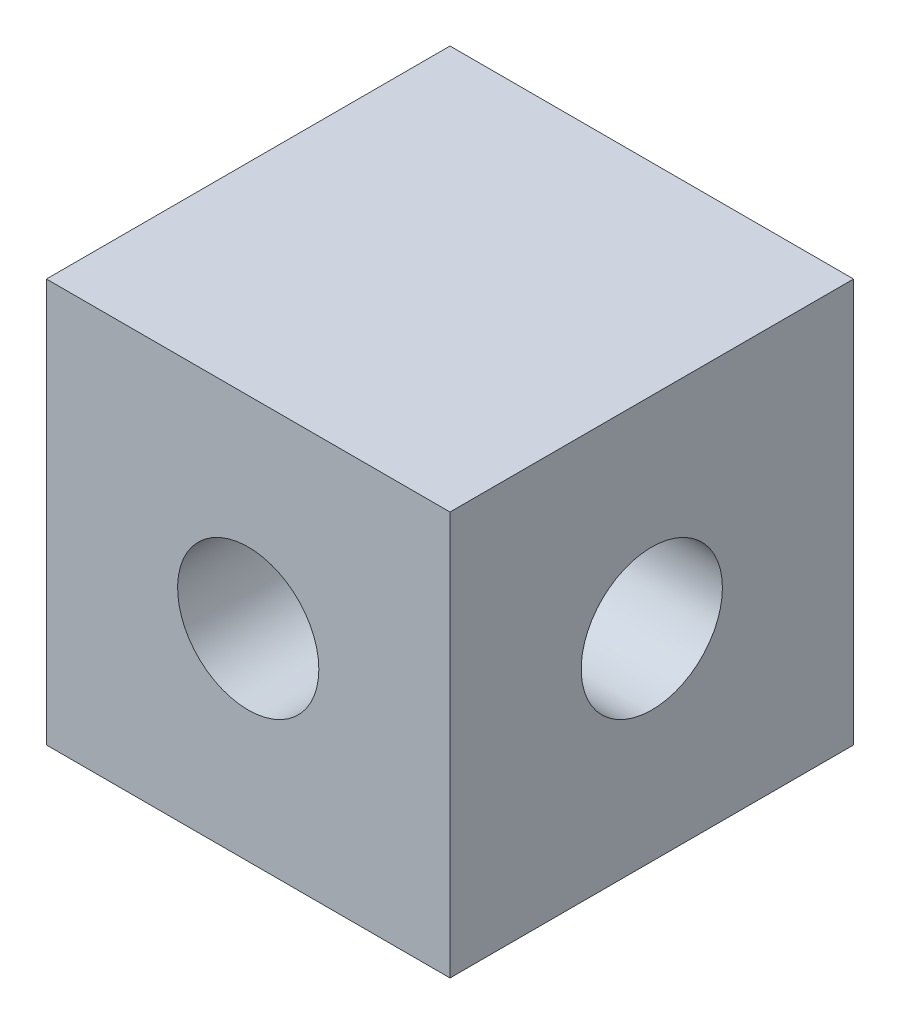
ISO-10303-21;
HEADER;
FILE_DESCRIPTION(('STEP AP214'),'2;1');
FILE_NAME('part.step','',(''),(''),'','','');
FILE_SCHEMA(('AUTOMOTIVE_DESIGN { 1 0 10303 214 1 1 1 1 }'));
ENDSEC;
DATA;
#1=APPLICATION_CONTEXT('core data for automotive mechanical design processes');
#2=APPLICATION_PROTOCOL_DEFINITION('international standard','automotive_design',2000,#1);
#3=PRODUCT_CONTEXT('',#1,'mechanical');
#4=PRODUCT('Part','Part','',(#3));
#5=PRODUCT_RELATED_PRODUCT_CATEGORY('part','',(#4));
#6=PRODUCT_DEFINITION_FORMATION('','',#4);
#7=PRODUCT_DEFINITION_CONTEXT('part definition',#1,'design');
#8=PRODUCT_DEFINITION('design','',#6,#7);
#9=PRODUCT_DEFINITION_SHAPE('','',#8);
#10=(LENGTH_UNIT() NAMED_UNIT(*) SI_UNIT(.MILLI.,.METRE.));
#11=(NAMED_UNIT(*) PLANE_ANGLE_UNIT() SI_UNIT($,.RADIAN.));
#12=(NAMED_UNIT(*) SI_UNIT($,.STERADIAN.) SOLID_ANGLE_UNIT());
#13=UNCERTAINTY_MEASURE_WITH_UNIT(LENGTH_MEASURE(1.E-05),#10,'distance_accuracy_value','');
#14=(GEOMETRIC_REPRESENTATION_CONTEXT(3) GLOBAL_UNCERTAINTY_ASSIGNED_CONTEXT((#13)) GLOBAL_UNIT_ASSIGNED_CONTEXT((#10,
#11,#12)) REPRESENTATION_CONTEXT('',''));
#15=CARTESIAN_POINT('',(0.,0.,0.));
#16=DIRECTION('',(0.,0.,1.));
#17=DIRECTION('',(1.,0.,0.));
#18=AXIS2_PLACEMENT_3D('',#15,#16,#17);
#19=CARTESIAN_POINT('',(0.,0.,10.));
#20=DIRECTION('',(0.,0.,-1.));
#21=DIRECTION('',(-1.,0.,0.));
#22=AXIS2_PLACEMENT_3D('',#19,#20,#21);
#23=CYLINDRICAL_SURFACE('',#22,1.75);
#24=CARTESIAN_POINT('',(0.,0.,5.));
#25=DIRECTION('',(0.707106781186547,0.,-0.707106781186547));
#26=DIRECTION('',(-0.707106781186547,0.,-0.707106781186547));
#27=AXIS2_PLACEMENT_3D('',#24,#25,#26);
#28=ELLIPSE('',#27,2.47487373415292,1.75);
#29=CARTESIAN_POINT('',(0.,-1.75,5.));
#30=VERTEX_POINT('',#29);
#31=CARTESIAN_POINT('',(0.,1.75,5.));
#32=VERTEX_POINT('',#31);
#33=EDGE_CURVE('E13',#30,#32,#28,.F.);
#34=ORIENTED_EDGE('',*,*,#33,.F.);
#35=CARTESIAN_POINT('',(0.,0.,5.));
#36=DIRECTION('',(-0.707106781186547,0.,-0.707106781186547));
#37=DIRECTION('',(0.707106781186547,0.,-0.707106781186547));
#38=AXIS2_PLACEMENT_3D('',#35,#36,#37);
#39=ELLIPSE('',#38,2.47487373415292,1.75);
#40=EDGE_CURVE('E60',#32,#30,#39,.F.);
#41=ORIENTED_EDGE('',*,*,#40,.F.);
#42=EDGE_LOOP('',(#34,#41));
#43=FACE_BOUND('',#42,.T.);
#44=CARTESIAN_POINT('',(0.,0.,10.));
#45=DIRECTION('',(0.,0.,1.));
#46=DIRECTION('',(1.,0.,0.));
#47=AXIS2_PLACEMENT_3D('',#44,#45,#46);
#48=CIRCLE('',#47,1.75);
#49=CARTESIAN_POINT('',(1.75,0.,10.));
#50=VERTEX_POINT('',#49);
#51=EDGE_CURVE('E135',#50,#50,#48,.T.);
#52=ORIENTED_EDGE('',*,*,#51,.T.);
#53=EDGE_LOOP('',(#52));
#54=FACE_BOUND('',#53,.T.);
#55=ADVANCED_FACE('F46',(#43,#54),#23,.F.);
#56=CARTESIAN_POINT('',(0.,0.,10.));
#57=DIRECTION('',(0.,0.,1.));
#58=DIRECTION('',(1.,0.,0.));
#59=AXIS2_PLACEMENT_3D('',#56,#57,#58);
#60=PLANE('',#59);
#61=DIRECTION('',(0.,-1.,0.));
#62=VECTOR('',#61,1.);
#63=CARTESIAN_POINT('',(-5.,-5.,10.));
#64=LINE('',#63,#62);
#65=CARTESIAN_POINT('',(-5.,5.,10.));
#66=VERTEX_POINT('',#65);
#67=CARTESIAN_POINT('',(-5.,-5.,10.));
#68=VERTEX_POINT('',#67);
#69=EDGE_CURVE('E127',#66,#68,#64,.T.);
#70=ORIENTED_EDGE('',*,*,#69,.T.);
#71=DIRECTION('',(1.,0.,0.));
#72=VECTOR('',#71,1.);
#73=CARTESIAN_POINT('',(5.,-5.,10.));
#74=LINE('',#73,#72);
#75=CARTESIAN_POINT('',(5.,-5.,10.));
#76=VERTEX_POINT('',#75);
#77=EDGE_CURVE('E98',#68,#76,#74,.T.);
#78=ORIENTED_EDGE('',*,*,#77,.T.);
#79=DIRECTION('',(0.,1.,0.));
#80=VECTOR('',#79,1.);
#81=CARTESIAN_POINT('',(5.,-5.,10.));
#82=LINE('',#81,#80);
#83=CARTESIAN_POINT('',(5.,5.,10.));
#84=VERTEX_POINT('',#83);
#85=EDGE_CURVE('E137',#76,#84,#82,.T.);
#86=ORIENTED_EDGE('',*,*,#85,.T.);
#87=DIRECTION('',(-1.,0.,0.));
#88=VECTOR('',#87,1.);
#89=CARTESIAN_POINT('',(5.,5.,10.));
#90=LINE('',#89,#88);
#91=EDGE_CURVE('E69',#84,#66,#90,.T.);
#92=ORIENTED_EDGE('',*,*,#91,.T.);
#93=EDGE_LOOP('',(#70,#78,#86,#92));
#94=FACE_BOUND('',#93,.T.);
#95=ORIENTED_EDGE('',*,*,#51,.F.);
#96=EDGE_LOOP('',(#95));
#97=FACE_BOUND('',#96,.T.);
#98=ADVANCED_FACE('F163',(#94,#97),#60,.T.);
#99=CARTESIAN_POINT('',(0.,0.,0.));
#100=DIRECTION('',(0.,0.,1.));
#101=DIRECTION('',(1.,0.,0.));
#102=AXIS2_PLACEMENT_3D('',#99,#100,#101);
#103=PLANE('',#102);
#104=DIRECTION('',(0.,-1.,0.));
#105=VECTOR('',#104,1.);
#106=CARTESIAN_POINT('',(-5.,-5.,0.));
#107=LINE('',#106,#105);
#108=CARTESIAN_POINT('',(-5.,5.,0.));
#109=VERTEX_POINT('',#108);
#110=CARTESIAN_POINT('',(-5.,-5.,0.));
#111=VERTEX_POINT('',#110);
#112=EDGE_CURVE('E132',#109,#111,#107,.T.);
#113=ORIENTED_EDGE('',*,*,#112,.F.);
#114=DIRECTION('',(-1.,0.,0.));
#115=VECTOR('',#114,1.);
#116=CARTESIAN_POINT('',(5.,5.,0.));
#117=LINE('',#116,#115);
#118=CARTESIAN_POINT('',(5.,5.,0.));
#119=VERTEX_POINT('',#118);
#120=EDGE_CURVE('E90',#119,#109,#117,.T.);
#121=ORIENTED_EDGE('',*,*,#120,.F.);
#122=DIRECTION('',(0.,1.,0.));
#123=VECTOR('',#122,1.);
#124=CARTESIAN_POINT('',(5.,-5.,0.));
#125=LINE('',#124,#123);
#126=CARTESIAN_POINT('',(5.,-5.,0.));
#127=VERTEX_POINT('',#126);
#128=EDGE_CURVE('E128',#127,#119,#125,.T.);
#129=ORIENTED_EDGE('',*,*,#128,.F.);
#130=DIRECTION('',(1.,0.,0.));
#131=VECTOR('',#130,1.);
#132=CARTESIAN_POINT('',(5.,-5.,0.));
#133=LINE('',#132,#131);
#134=EDGE_CURVE('E130',#111,#127,#133,.T.);
#135=ORIENTED_EDGE('',*,*,#134,.F.);
#136=EDGE_LOOP('',(#113,#121,#129,#135));
#137=FACE_BOUND('',#136,.T.);
#138=CARTESIAN_POINT('',(0.,0.,0.));
#139=DIRECTION('',(0.,0.,1.));
#140=DIRECTION('',(1.,0.,0.));
#141=AXIS2_PLACEMENT_3D('',#138,#139,#140);
#142=CIRCLE('',#141,1.75);
#143=CARTESIAN_POINT('',(1.75,0.,0.));
#144=VERTEX_POINT('',#143);
#145=EDGE_CURVE('E141',#144,#144,#142,.T.);
#146=ORIENTED_EDGE('',*,*,#145,.T.);
#147=EDGE_LOOP('',(#146));
#148=FACE_BOUND('',#147,.T.);
#149=ADVANCED_FACE('F167',(#137,#148),#103,.F.);
#150=CARTESIAN_POINT('',(-5.,-5.,10.));
#151=DIRECTION('',(1.,0.,0.));
#152=DIRECTION('',(0.,0.,-1.));
#153=AXIS2_PLACEMENT_3D('',#150,#151,#152);
#154=PLANE('',#153);
#155=ORIENTED_EDGE('',*,*,#112,.T.);
#156=DIRECTION('',(0.,0.,-1.));
#157=VECTOR('',#156,1.);
#158=CARTESIAN_POINT('',(-5.,-5.,10.));
#159=LINE('',#158,#157);
#160=EDGE_CURVE('E112',#68,#111,#159,.T.);
#161=ORIENTED_EDGE('',*,*,#160,.F.);
#162=ORIENTED_EDGE('',*,*,#69,.F.);
#163=DIRECTION('',(0.,0.,-1.));
#164=VECTOR('',#163,1.);
#165=CARTESIAN_POINT('',(-5.,5.,10.));
#166=LINE('',#165,#164);
#167=EDGE_CURVE('E124',#66,#109,#166,.T.);
#168=ORIENTED_EDGE('',*,*,#167,.T.);
#169=EDGE_LOOP('',(#155,#161,#162,#168));
#170=FACE_BOUND('',#169,.T.);
#171=ADVANCED_FACE('F48',(#170),#154,.F.);
#172=CARTESIAN_POINT('',(5.,-5.,10.));
#173=DIRECTION('',(0.,1.,0.));
#174=DIRECTION('',(-1.,0.,0.));
#175=AXIS2_PLACEMENT_3D('',#172,#173,#174);
#176=PLANE('',#175);
#177=ORIENTED_EDGE('',*,*,#134,.T.);
#178=DIRECTION('',(0.,0.,-1.));
#179=VECTOR('',#178,1.);
#180=CARTESIAN_POINT('',(5.,-5.,10.));
#181=LINE('',#180,#179);
#182=EDGE_CURVE('E119',#76,#127,#181,.T.);
#183=ORIENTED_EDGE('',*,*,#182,.F.);
#184=ORIENTED_EDGE('',*,*,#77,.F.);
#185=ORIENTED_EDGE('',*,*,#160,.T.);
#186=EDGE_LOOP('',(#177,#183,#184,#185));
#187=FACE_BOUND('',#186,.T.);
#188=ADVANCED_FACE('F179',(#187),#176,.F.);
#189=CARTESIAN_POINT('',(5.,-5.,10.));
#190=DIRECTION('',(-1.,0.,0.));
#191=DIRECTION('',(0.,0.,1.));
#192=AXIS2_PLACEMENT_3D('',#189,#190,#191);
#193=PLANE('',#192);
#194=CARTESIAN_POINT('',(5.,0.,5.));
#195=DIRECTION('',(1.,0.,0.));
#196=DIRECTION('',(0.,0.,-1.));
#197=AXIS2_PLACEMENT_3D('',#194,#195,#196);
#198=CIRCLE('',#197,1.75);
#199=CARTESIAN_POINT('',(5.,0.,3.25));
#200=VERTEX_POINT('',#199);
#201=EDGE_CURVE('E147',#200,#200,#198,.T.);
#202=ORIENTED_EDGE('',*,*,#201,.F.);
#203=EDGE_LOOP('',(#202));
#204=FACE_BOUND('',#203,.T.);
#205=ORIENTED_EDGE('',*,*,#128,.T.);
#206=DIRECTION('',(0.,0.,-1.));
#207=VECTOR('',#206,1.);
#208=CARTESIAN_POINT('',(5.,5.,10.));
#209=LINE('',#208,#207);
#210=EDGE_CURVE('E122',#84,#119,#209,.T.);
#211=ORIENTED_EDGE('',*,*,#210,.F.);
#212=ORIENTED_EDGE('',*,*,#85,.F.);
#213=ORIENTED_EDGE('',*,*,#182,.T.);
#214=EDGE_LOOP('',(#205,#211,#212,#213));
#215=FACE_BOUND('',#214,.T.);
#216=ADVANCED_FACE('F174',(#204,#215),#193,.F.);
#217=CARTESIAN_POINT('',(5.,5.,10.));
#218=DIRECTION('',(0.,-1.,0.));
#219=DIRECTION('',(1.,0.,0.));
#220=AXIS2_PLACEMENT_3D('',#217,#218,#219);
#221=PLANE('',#220);
#222=ORIENTED_EDGE('',*,*,#120,.T.);
#223=ORIENTED_EDGE('',*,*,#167,.F.);
#224=ORIENTED_EDGE('',*,*,#91,.F.);
#225=ORIENTED_EDGE('',*,*,#210,.T.);
#226=EDGE_LOOP('',(#222,#223,#224,#225));
#227=FACE_BOUND('',#226,.T.);
#228=ADVANCED_FACE('F170',(#227),#221,.F.);
#229=CARTESIAN_POINT('',(0.,0.,5.));
#230=DIRECTION('',(0.707106781186547,0.,-0.707106781186547));
#231=DIRECTION('',(-0.707106781186547,0.,-0.707106781186547));
#232=AXIS2_PLACEMENT_3D('',#229,#230,#231);
#233=ELLIPSE('',#232,2.47487373415292,1.75);
#234=EDGE_CURVE('E54',#30,#32,#233,.T.);
#235=ORIENTED_EDGE('',*,*,#234,.F.);
#236=CARTESIAN_POINT('',(0.,0.,5.));
#237=DIRECTION('',(-0.707106781186547,0.,-0.707106781186547));
#238=DIRECTION('',(0.707106781186547,0.,-0.707106781186547));
#239=AXIS2_PLACEMENT_3D('',#236,#237,#238);
#240=ELLIPSE('',#239,2.47487373415292,1.75);
#241=EDGE_CURVE('E103',#32,#30,#240,.T.);
#242=ORIENTED_EDGE('',*,*,#241,.F.);
#243=EDGE_LOOP('',(#235,#242));
#244=FACE_BOUND('',#243,.T.);
#245=ORIENTED_EDGE('',*,*,#145,.F.);
#246=EDGE_LOOP('',(#245));
#247=FACE_BOUND('',#246,.T.);
#248=ADVANCED_FACE('F115',(#244,#247),#23,.F.);
#249=CARTESIAN_POINT('',(-3.,0.,5.));
#250=DIRECTION('',(1.,0.,0.));
#251=DIRECTION('',(0.,0.,-1.));
#252=AXIS2_PLACEMENT_3D('',#249,#250,#251);
#253=PLANE('',#252);
#254=CARTESIAN_POINT('',(-3.,0.,5.));
#255=DIRECTION('',(1.,0.,0.));
#256=DIRECTION('',(0.,0.,-1.));
#257=AXIS2_PLACEMENT_3D('',#254,#255,#256);
#258=CIRCLE('',#257,1.75);
#259=CARTESIAN_POINT('',(-3.,0.,3.25));
#260=VERTEX_POINT('',#259);
#261=EDGE_CURVE('E144',#260,#260,#258,.T.);
#262=ORIENTED_EDGE('',*,*,#261,.T.);
#263=EDGE_LOOP('',(#262));
#264=FACE_BOUND('',#263,.T.);
#265=ADVANCED_FACE('F153',(#264),#253,.T.);
#266=CARTESIAN_POINT('',(-3.,0.,5.));
#267=DIRECTION('',(1.,0.,0.));
#268=DIRECTION('',(0.,0.,-1.));
#269=AXIS2_PLACEMENT_3D('',#266,#267,#268);
#270=CYLINDRICAL_SURFACE('',#269,1.75);
#271=ORIENTED_EDGE('',*,*,#234,.T.);
#272=ORIENTED_EDGE('',*,*,#40,.T.);
#273=EDGE_LOOP('',(#271,#272));
#274=FACE_BOUND('',#273,.T.);
#275=ORIENTED_EDGE('',*,*,#261,.F.);
#276=EDGE_LOOP('',(#275));
#277=FACE_BOUND('',#276,.T.);
#278=ADVANCED_FACE('F110',(#274,#277),#270,.F.);
#279=ORIENTED_EDGE('',*,*,#33,.T.);
#280=ORIENTED_EDGE('',*,*,#241,.T.);
#281=EDGE_LOOP('',(#279,#280));
#282=FACE_BOUND('',#281,.T.);
#283=ORIENTED_EDGE('',*,*,#201,.T.);
#284=EDGE_LOOP('',(#283));
#285=FACE_BOUND('',#284,.T.);
#286=ADVANCED_FACE('F104',(#282,#285),#270,.F.);
#287=CLOSED_SHELL('',(#55,#98,#149,#171,#188,#216,#228,#248,#265,#278,#286));
#288=MANIFOLD_SOLID_BREP('B2',#287);
#289=ADVANCED_BREP_SHAPE_REPRESENTATION('',(#18,#288),#14);
#290=SHAPE_DEFINITION_REPRESENTATION(#9,#289);
ENDSEC;
END-ISO-10303-21;
